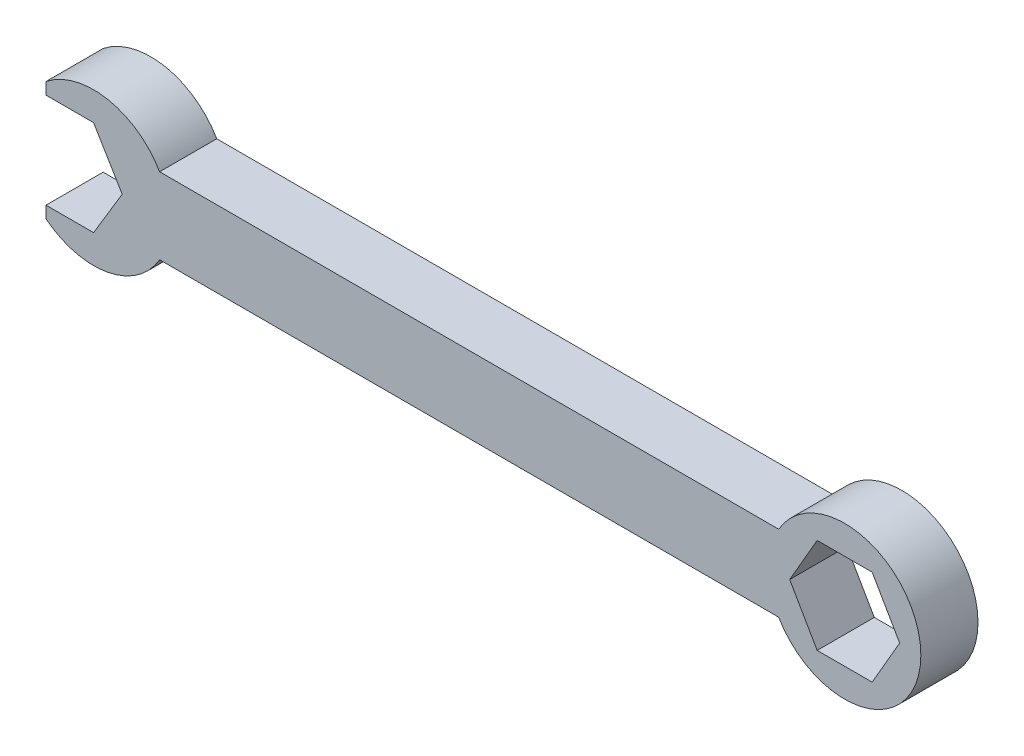
ISO-10303-21;
HEADER;
FILE_DESCRIPTION(('STEP AP214'),'2;1');
FILE_NAME('part.step','',(''),(''),'','','');
FILE_SCHEMA(('AUTOMOTIVE_DESIGN { 1 0 10303 214 1 1 1 1 }'));
ENDSEC;
DATA;
#1=APPLICATION_CONTEXT('core data for automotive mechanical design processes');
#2=APPLICATION_PROTOCOL_DEFINITION('international standard','automotive_design',2000,#1);
#3=PRODUCT_CONTEXT('',#1,'mechanical');
#4=PRODUCT('Part','Part','',(#3));
#5=PRODUCT_RELATED_PRODUCT_CATEGORY('part','',(#4));
#6=PRODUCT_DEFINITION_FORMATION('','',#4);
#7=PRODUCT_DEFINITION_CONTEXT('part definition',#1,'design');
#8=PRODUCT_DEFINITION('design','',#6,#7);
#9=PRODUCT_DEFINITION_SHAPE('','',#8);
#10=(LENGTH_UNIT() NAMED_UNIT(*) SI_UNIT(.MILLI.,.METRE.));
#11=(NAMED_UNIT(*) PLANE_ANGLE_UNIT() SI_UNIT($,.RADIAN.));
#12=(NAMED_UNIT(*) SI_UNIT($,.STERADIAN.) SOLID_ANGLE_UNIT());
#13=UNCERTAINTY_MEASURE_WITH_UNIT(LENGTH_MEASURE(1.E-05),#10,'distance_accuracy_value','');
#14=(GEOMETRIC_REPRESENTATION_CONTEXT(3) GLOBAL_UNCERTAINTY_ASSIGNED_CONTEXT((#13)) GLOBAL_UNIT_ASSIGNED_CONTEXT((#10,
#11,#12)) REPRESENTATION_CONTEXT('',''));
#15=CARTESIAN_POINT('',(0.,0.,0.));
#16=DIRECTION('',(0.,0.,1.));
#17=DIRECTION('',(1.,0.,0.));
#18=AXIS2_PLACEMENT_3D('',#15,#16,#17);
#19=CARTESIAN_POINT('',(77.752488467706,-44.8904201469934,7.62));
#20=DIRECTION('',(-0.866025403784438,0.500000000000001,0.));
#21=DIRECTION('',(-0.500000000000001,-0.866025403784438,0.));
#22=AXIS2_PLACEMENT_3D('',#19,#20,#21);
#23=PLANE('',#22);
#24=DIRECTION('',(0.500000000000001,0.866025403784438,0.));
#25=VECTOR('',#24,1.);
#26=CARTESIAN_POINT('',(77.752488467706,-44.8904201469934,0.));
#27=LINE('',#26,#25);
#28=CARTESIAN_POINT('',(100.003810414254,-6.35,0.));
#29=VERTEX_POINT('',#28);
#30=CARTESIAN_POINT('',(103.669984623608,0.,0.));
#31=VERTEX_POINT('',#30);
#32=EDGE_CURVE('E243',#29,#31,#27,.T.);
#33=ORIENTED_EDGE('',*,*,#32,.F.);
#34=DIRECTION('',(0.,0.,-1.));
#35=VECTOR('',#34,1.);
#36=CARTESIAN_POINT('',(100.003810414254,-6.35,7.62));
#37=LINE('',#36,#35);
#38=CARTESIAN_POINT('',(100.003810414254,-6.35,7.62));
#39=VERTEX_POINT('',#38);
#40=EDGE_CURVE('E11',#39,#29,#37,.T.);
#41=ORIENTED_EDGE('',*,*,#40,.F.);
#42=DIRECTION('',(0.500000000000001,0.866025403784438,0.));
#43=VECTOR('',#42,1.);
#44=CARTESIAN_POINT('',(77.752488467706,-44.8904201469934,7.62));
#45=LINE('',#44,#43);
#46=CARTESIAN_POINT('',(103.669984623608,0.,7.62));
#47=VERTEX_POINT('',#46);
#48=EDGE_CURVE('E360',#39,#47,#45,.T.);
#49=ORIENTED_EDGE('',*,*,#48,.T.);
#50=DIRECTION('',(0.,0.,-1.));
#51=VECTOR('',#50,1.);
#52=CARTESIAN_POINT('',(103.669984623608,0.,7.62));
#53=LINE('',#52,#51);
#54=EDGE_CURVE('E65',#47,#31,#53,.T.);
#55=ORIENTED_EDGE('',*,*,#54,.T.);
#56=EDGE_LOOP('',(#33,#41,#49,#55));
#57=FACE_BOUND('',#56,.T.);
#58=ADVANCED_FACE('F45',(#57),#23,.T.);
#59=CARTESIAN_POINT('',(0.,-6.35000000000003,7.62));
#60=DIRECTION('',(0.,1.,0.));
#61=DIRECTION('',(-1.,0.,0.));
#62=AXIS2_PLACEMENT_3D('',#59,#60,#61);
#63=PLANE('',#62);
#64=DIRECTION('',(1.,0.,0.));
#65=VECTOR('',#64,1.);
#66=CARTESIAN_POINT('',(0.,-6.35000000000003,0.));
#67=LINE('',#66,#65);
#68=CARTESIAN_POINT('',(92.6714619955457,-6.35000000000001,0.));
#69=VERTEX_POINT('',#68);
#70=EDGE_CURVE('E246',#69,#29,#67,.T.);
#71=ORIENTED_EDGE('',*,*,#70,.F.);
#72=DIRECTION('',(0.,0.,-1.));
#73=VECTOR('',#72,1.);
#74=CARTESIAN_POINT('',(92.6714619955457,-6.35000000000001,7.62));
#75=LINE('',#74,#73);
#76=CARTESIAN_POINT('',(92.6714619955457,-6.35000000000001,7.62));
#77=VERTEX_POINT('',#76);
#78=EDGE_CURVE('E56',#77,#69,#75,.T.);
#79=ORIENTED_EDGE('',*,*,#78,.F.);
#80=DIRECTION('',(1.,0.,0.));
#81=VECTOR('',#80,1.);
#82=CARTESIAN_POINT('',(0.,-6.35000000000003,7.62));
#83=LINE('',#82,#81);
#84=EDGE_CURVE('E363',#77,#39,#83,.T.);
#85=ORIENTED_EDGE('',*,*,#84,.T.);
#86=ORIENTED_EDGE('',*,*,#40,.T.);
#87=EDGE_LOOP('',(#71,#79,#85,#86));
#88=FACE_BOUND('',#87,.T.);
#89=ADVANCED_FACE('F386',(#88),#63,.T.);
#90=CARTESIAN_POINT('',(66.7539658396437,38.5404201469933,7.62));
#91=DIRECTION('',(0.866025403784439,0.499999999999999,0.));
#92=DIRECTION('',(-0.499999999999999,0.866025403784439,0.));
#93=AXIS2_PLACEMENT_3D('',#90,#91,#92);
#94=PLANE('',#93);
#95=DIRECTION('',(0.499999999999999,-0.866025403784439,0.));
#96=VECTOR('',#95,1.);
#97=CARTESIAN_POINT('',(66.7539658396437,38.5404201469933,0.));
#98=LINE('',#97,#96);
#99=CARTESIAN_POINT('',(89.0052877861915,0.,0.));
#100=VERTEX_POINT('',#99);
#101=EDGE_CURVE('E250',#100,#69,#98,.T.);
#102=ORIENTED_EDGE('',*,*,#101,.F.);
#103=DIRECTION('',(0.,0.,-1.));
#104=VECTOR('',#103,1.);
#105=CARTESIAN_POINT('',(89.0052877861915,0.,7.62));
#106=LINE('',#105,#104);
#107=CARTESIAN_POINT('',(89.0052877861915,0.,7.62));
#108=VERTEX_POINT('',#107);
#109=EDGE_CURVE('E183',#108,#100,#106,.T.);
#110=ORIENTED_EDGE('',*,*,#109,.F.);
#111=DIRECTION('',(0.499999999999999,-0.866025403784439,0.));
#112=VECTOR('',#111,1.);
#113=CARTESIAN_POINT('',(66.7539658396437,38.5404201469933,7.62));
#114=LINE('',#113,#112);
#115=EDGE_CURVE('E194',#108,#77,#114,.T.);
#116=ORIENTED_EDGE('',*,*,#115,.T.);
#117=ORIENTED_EDGE('',*,*,#78,.T.);
#118=EDGE_LOOP('',(#102,#110,#116,#117));
#119=FACE_BOUND('',#118,.T.);
#120=ADVANCED_FACE('F369',(#119),#94,.T.);
#121=CARTESIAN_POINT('',(66.7539658396437,-38.5404201469933,7.62));
#122=DIRECTION('',(0.866025403784439,-0.5,0.));
#123=DIRECTION('',(0.5,0.866025403784439,0.));
#124=AXIS2_PLACEMENT_3D('',#121,#122,#123);
#125=PLANE('',#124);
#126=DIRECTION('',(-0.5,-0.866025403784439,0.));
#127=VECTOR('',#126,1.);
#128=CARTESIAN_POINT('',(66.7539658396437,-38.5404201469933,0.));
#129=LINE('',#128,#127);
#130=CARTESIAN_POINT('',(92.6714619955457,6.35,0.));
#131=VERTEX_POINT('',#130);
#132=EDGE_CURVE('E178',#131,#100,#129,.T.);
#133=ORIENTED_EDGE('',*,*,#132,.F.);
#134=DIRECTION('',(0.,0.,-1.));
#135=VECTOR('',#134,1.);
#136=CARTESIAN_POINT('',(92.6714619955457,6.35,7.62));
#137=LINE('',#136,#135);
#138=CARTESIAN_POINT('',(92.6714619955457,6.35,7.62));
#139=VERTEX_POINT('',#138);
#140=EDGE_CURVE('E173',#139,#131,#137,.T.);
#141=ORIENTED_EDGE('',*,*,#140,.F.);
#142=DIRECTION('',(-0.5,-0.866025403784439,0.));
#143=VECTOR('',#142,1.);
#144=CARTESIAN_POINT('',(66.7539658396437,-38.5404201469933,7.62));
#145=LINE('',#144,#143);
#146=EDGE_CURVE('E176',#139,#108,#145,.T.);
#147=ORIENTED_EDGE('',*,*,#146,.T.);
#148=ORIENTED_EDGE('',*,*,#109,.T.);
#149=EDGE_LOOP('',(#133,#141,#147,#148));
#150=FACE_BOUND('',#149,.T.);
#151=ADVANCED_FACE('F175',(#150),#125,.T.);
#152=CARTESIAN_POINT('',(0.,6.35,7.62));
#153=DIRECTION('',(0.,-1.,0.));
#154=DIRECTION('',(0.,0.,-1.));
#155=AXIS2_PLACEMENT_3D('',#152,#153,#154);
#156=PLANE('',#155);
#157=DIRECTION('',(-1.,0.,0.));
#158=VECTOR('',#157,1.);
#159=CARTESIAN_POINT('',(0.,6.35,0.));
#160=LINE('',#159,#158);
#161=CARTESIAN_POINT('',(100.003810414254,6.34999999999999,0.));
#162=VERTEX_POINT('',#161);
#163=EDGE_CURVE('E256',#162,#131,#160,.T.);
#164=ORIENTED_EDGE('',*,*,#163,.F.);
#165=DIRECTION('',(0.,0.,-1.));
#166=VECTOR('',#165,1.);
#167=CARTESIAN_POINT('',(100.003810414254,6.34999999999999,7.62));
#168=LINE('',#167,#166);
#169=CARTESIAN_POINT('',(100.003810414254,6.34999999999999,7.62));
#170=VERTEX_POINT('',#169);
#171=EDGE_CURVE('E117',#170,#162,#168,.T.);
#172=ORIENTED_EDGE('',*,*,#171,.F.);
#173=DIRECTION('',(-1.,0.,0.));
#174=VECTOR('',#173,1.);
#175=CARTESIAN_POINT('',(0.,6.35,7.62));
#176=LINE('',#175,#174);
#177=EDGE_CURVE('E191',#170,#139,#176,.T.);
#178=ORIENTED_EDGE('',*,*,#177,.T.);
#179=ORIENTED_EDGE('',*,*,#140,.T.);
#180=EDGE_LOOP('',(#164,#172,#178,#179));
#181=FACE_BOUND('',#180,.T.);
#182=ADVANCED_FACE('F197',(#181),#156,.T.);
#183=CARTESIAN_POINT('',(-3.81,0.,7.62));
#184=DIRECTION('',(0.,0.,-1.));
#185=DIRECTION('',(-1.,0.,0.));
#186=AXIS2_PLACEMENT_3D('',#183,#184,#185);
#187=CYLINDRICAL_SURFACE('',#186,10.16);
#188=CARTESIAN_POINT('',(-3.81,0.,0.));
#189=DIRECTION('',(0.,0.,1.));
#190=DIRECTION('',(1.,0.,0.));
#191=AXIS2_PLACEMENT_3D('',#188,#189,#190);
#192=CIRCLE('',#191,10.16);
#193=CARTESIAN_POINT('',(-10.16,-7.93114745796597,0.));
#194=VERTEX_POINT('',#193);
#195=CARTESIAN_POINT('',(4.98881810244989,-5.08,0.));
#196=VERTEX_POINT('',#195);
#197=EDGE_CURVE('E206',#194,#196,#192,.T.);
#198=ORIENTED_EDGE('',*,*,#197,.T.);
#199=DIRECTION('',(0.,0.,-1.));
#200=VECTOR('',#199,1.);
#201=CARTESIAN_POINT('',(4.98881810244989,-5.08,7.62));
#202=LINE('',#201,#200);
#203=CARTESIAN_POINT('',(4.98881810244989,-5.08,7.62));
#204=VERTEX_POINT('',#203);
#205=EDGE_CURVE('E49',#204,#196,#202,.T.);
#206=ORIENTED_EDGE('',*,*,#205,.F.);
#207=CARTESIAN_POINT('',(-3.81,0.,7.62));
#208=DIRECTION('',(0.,0.,1.));
#209=DIRECTION('',(1.,0.,0.));
#210=AXIS2_PLACEMENT_3D('',#207,#208,#209);
#211=CIRCLE('',#210,10.16);
#212=CARTESIAN_POINT('',(-10.16,-7.93114745796597,7.62));
#213=VERTEX_POINT('',#212);
#214=EDGE_CURVE('E263',#213,#204,#211,.T.);
#215=ORIENTED_EDGE('',*,*,#214,.F.);
#216=DIRECTION('',(0.,0.,-1.));
#217=VECTOR('',#216,1.);
#218=CARTESIAN_POINT('',(-10.16,-7.93114745796597,7.62));
#219=LINE('',#218,#217);
#220=EDGE_CURVE('E202',#213,#194,#219,.T.);
#221=ORIENTED_EDGE('',*,*,#220,.T.);
#222=EDGE_LOOP('',(#198,#206,#215,#221));
#223=FACE_BOUND('',#222,.T.);
#224=ADVANCED_FACE('F311',(#223),#187,.T.);
#225=CARTESIAN_POINT('',(0.,-5.08,7.62));
#226=DIRECTION('',(0.,1.,0.));
#227=DIRECTION('',(0.,0.,1.));
#228=AXIS2_PLACEMENT_3D('',#225,#226,#227);
#229=PLANE('',#228);
#230=DIRECTION('',(1.,0.,0.));
#231=VECTOR('',#230,1.);
#232=CARTESIAN_POINT('',(0.,-5.08,0.));
#233=LINE('',#232,#231);
#234=CARTESIAN_POINT('',(87.5388181024499,-5.08,0.));
#235=VERTEX_POINT('',#234);
#236=EDGE_CURVE('E210',#196,#235,#233,.T.);
#237=ORIENTED_EDGE('',*,*,#236,.T.);
#238=DIRECTION('',(0.,0.,-1.));
#239=VECTOR('',#238,1.);
#240=CARTESIAN_POINT('',(87.5388181024499,-5.08,7.62));
#241=LINE('',#240,#239);
#242=CARTESIAN_POINT('',(87.5388181024499,-5.08,7.62));
#243=VERTEX_POINT('',#242);
#244=EDGE_CURVE('E300',#243,#235,#241,.T.);
#245=ORIENTED_EDGE('',*,*,#244,.F.);
#246=DIRECTION('',(1.,0.,0.));
#247=VECTOR('',#246,1.);
#248=CARTESIAN_POINT('',(0.,-5.08,7.62));
#249=LINE('',#248,#247);
#250=EDGE_CURVE('E130',#204,#243,#249,.T.);
#251=ORIENTED_EDGE('',*,*,#250,.F.);
#252=ORIENTED_EDGE('',*,*,#205,.T.);
#253=EDGE_LOOP('',(#237,#245,#251,#252));
#254=FACE_BOUND('',#253,.T.);
#255=ADVANCED_FACE('F47',(#254),#229,.F.);
#256=CARTESIAN_POINT('',(96.3376362048998,0.,7.62));
#257=DIRECTION('',(0.,0.,-1.));
#258=DIRECTION('',(-1.,0.,0.));
#259=AXIS2_PLACEMENT_3D('',#256,#257,#258);
#260=CYLINDRICAL_SURFACE('',#259,10.16);
#261=CARTESIAN_POINT('',(96.3376362048998,0.,0.));
#262=DIRECTION('',(0.,0.,1.));
#263=DIRECTION('',(1.,0.,0.));
#264=AXIS2_PLACEMENT_3D('',#261,#262,#263);
#265=CIRCLE('',#264,10.16);
#266=CARTESIAN_POINT('',(87.5388181024499,5.08,0.));
#267=VERTEX_POINT('',#266);
#268=EDGE_CURVE('E214',#235,#267,#265,.T.);
#269=ORIENTED_EDGE('',*,*,#268,.T.);
#270=DIRECTION('',(0.,0.,-1.));
#271=VECTOR('',#270,1.);
#272=CARTESIAN_POINT('',(87.5388181024499,5.08,7.62));
#273=LINE('',#272,#271);
#274=CARTESIAN_POINT('',(87.5388181024499,5.08,7.62));
#275=VERTEX_POINT('',#274);
#276=EDGE_CURVE('E298',#275,#267,#273,.T.);
#277=ORIENTED_EDGE('',*,*,#276,.F.);
#278=CARTESIAN_POINT('',(96.3376362048998,0.,7.62));
#279=DIRECTION('',(0.,0.,1.));
#280=DIRECTION('',(1.,0.,0.));
#281=AXIS2_PLACEMENT_3D('',#278,#279,#280);
#282=CIRCLE('',#281,10.16);
#283=EDGE_CURVE('E323',#243,#275,#282,.T.);
#284=ORIENTED_EDGE('',*,*,#283,.F.);
#285=ORIENTED_EDGE('',*,*,#244,.T.);
#286=EDGE_LOOP('',(#269,#277,#284,#285));
#287=FACE_BOUND('',#286,.T.);
#288=ADVANCED_FACE('F321',(#287),#260,.T.);
#289=CARTESIAN_POINT('',(0.,5.08,7.62));
#290=DIRECTION('',(0.,1.,0.));
#291=DIRECTION('',(0.,0.,1.));
#292=AXIS2_PLACEMENT_3D('',#289,#290,#291);
#293=PLANE('',#292);
#294=DIRECTION('',(1.,0.,0.));
#295=VECTOR('',#294,1.);
#296=CARTESIAN_POINT('',(0.,5.08,0.));
#297=LINE('',#296,#295);
#298=CARTESIAN_POINT('',(4.98881810244989,5.08,0.));
#299=VERTEX_POINT('',#298);
#300=EDGE_CURVE('E218',#299,#267,#297,.T.);
#301=ORIENTED_EDGE('',*,*,#300,.F.);
#302=DIRECTION('',(0.,0.,-1.));
#303=VECTOR('',#302,1.);
#304=CARTESIAN_POINT('',(4.98881810244989,5.08,7.62));
#305=LINE('',#304,#303);
#306=CARTESIAN_POINT('',(4.98881810244989,5.08,7.62));
#307=VERTEX_POINT('',#306);
#308=EDGE_CURVE('E295',#307,#299,#305,.T.);
#309=ORIENTED_EDGE('',*,*,#308,.F.);
#310=DIRECTION('',(1.,0.,0.));
#311=VECTOR('',#310,1.);
#312=CARTESIAN_POINT('',(0.,5.08,7.62));
#313=LINE('',#312,#311);
#314=EDGE_CURVE('E326',#307,#275,#313,.T.);
#315=ORIENTED_EDGE('',*,*,#314,.T.);
#316=ORIENTED_EDGE('',*,*,#276,.T.);
#317=EDGE_LOOP('',(#301,#309,#315,#316));
#318=FACE_BOUND('',#317,.T.);
#319=ADVANCED_FACE('F327',(#318),#293,.T.);
#320=CARTESIAN_POINT('',(-10.16,7.93114745796596,0.));
#321=VERTEX_POINT('',#320);
#322=EDGE_CURVE('E211',#299,#321,#192,.T.);
#323=ORIENTED_EDGE('',*,*,#322,.T.);
#324=DIRECTION('',(0.,0.,-1.));
#325=VECTOR('',#324,1.);
#326=CARTESIAN_POINT('',(-10.16,7.93114745796596,7.62));
#327=LINE('',#326,#325);
#328=CARTESIAN_POINT('',(-10.16,7.93114745796596,7.62));
#329=VERTEX_POINT('',#328);
#330=EDGE_CURVE('E292',#329,#321,#327,.T.);
#331=ORIENTED_EDGE('',*,*,#330,.F.);
#332=EDGE_CURVE('E331',#307,#329,#211,.T.);
#333=ORIENTED_EDGE('',*,*,#332,.F.);
#334=ORIENTED_EDGE('',*,*,#308,.T.);
#335=EDGE_LOOP('',(#323,#331,#333,#334));
#336=FACE_BOUND('',#335,.T.);
#337=ADVANCED_FACE('F413',(#336),#187,.T.);
#338=CARTESIAN_POINT('',(-10.16,0.,7.62));
#339=DIRECTION('',(-1.,0.,0.));
#340=DIRECTION('',(0.,0.,1.));
#341=AXIS2_PLACEMENT_3D('',#338,#339,#340);
#342=PLANE('',#341);
#343=DIRECTION('',(0.,1.,0.));
#344=VECTOR('',#343,1.);
#345=CARTESIAN_POINT('',(-10.16,0.,0.));
#346=LINE('',#345,#344);
#347=CARTESIAN_POINT('',(-10.16,6.35,0.));
#348=VERTEX_POINT('',#347);
#349=EDGE_CURVE('E222',#348,#321,#346,.T.);
#350=ORIENTED_EDGE('',*,*,#349,.F.);
#351=DIRECTION('',(0.,0.,-1.));
#352=VECTOR('',#351,1.);
#353=CARTESIAN_POINT('',(-10.16,6.35,7.62));
#354=LINE('',#353,#352);
#355=CARTESIAN_POINT('',(-10.16,6.35,7.62));
#356=VERTEX_POINT('',#355);
#357=EDGE_CURVE('E289',#356,#348,#354,.T.);
#358=ORIENTED_EDGE('',*,*,#357,.F.);
#359=DIRECTION('',(0.,1.,0.));
#360=VECTOR('',#359,1.);
#361=CARTESIAN_POINT('',(-10.16,0.,7.62));
#362=LINE('',#361,#360);
#363=EDGE_CURVE('E335',#356,#329,#362,.T.);
#364=ORIENTED_EDGE('',*,*,#363,.T.);
#365=ORIENTED_EDGE('',*,*,#330,.T.);
#366=EDGE_LOOP('',(#350,#358,#364,#365));
#367=FACE_BOUND('',#366,.T.);
#368=ADVANCED_FACE('F409',(#367),#342,.T.);
#369=CARTESIAN_POINT('',(0.,6.35,7.62));
#370=DIRECTION('',(0.,-1.,0.));
#371=DIRECTION('',(1.,0.,0.));
#372=AXIS2_PLACEMENT_3D('',#369,#370,#371);
#373=PLANE('',#372);
#374=DIRECTION('',(-1.,0.,0.));
#375=VECTOR('',#374,1.);
#376=CARTESIAN_POINT('',(0.,6.35,0.));
#377=LINE('',#376,#375);
#378=CARTESIAN_POINT('',(-3.81,6.35,0.));
#379=VERTEX_POINT('',#378);
#380=EDGE_CURVE('E226',#379,#348,#377,.T.);
#381=ORIENTED_EDGE('',*,*,#380,.F.);
#382=DIRECTION('',(0.,0.,-1.));
#383=VECTOR('',#382,1.);
#384=CARTESIAN_POINT('',(-3.81,6.35,7.62));
#385=LINE('',#384,#383);
#386=CARTESIAN_POINT('',(-3.81,6.35,7.62));
#387=VERTEX_POINT('',#386);
#388=EDGE_CURVE('E286',#387,#379,#385,.T.);
#389=ORIENTED_EDGE('',*,*,#388,.F.);
#390=DIRECTION('',(-1.,0.,0.));
#391=VECTOR('',#390,1.);
#392=CARTESIAN_POINT('',(0.,6.35,7.62));
#393=LINE('',#392,#391);
#394=EDGE_CURVE('E343',#387,#356,#393,.T.);
#395=ORIENTED_EDGE('',*,*,#394,.T.);
#396=ORIENTED_EDGE('',*,*,#357,.T.);
#397=EDGE_LOOP('',(#381,#389,#395,#396));
#398=FACE_BOUND('',#397,.T.);
#399=ADVANCED_FACE('F405',(#398),#373,.T.);
#400=CARTESIAN_POINT('',(0.,0.,7.62));
#401=DIRECTION('',(-0.857492925712544,-0.514495755427527,0.));
#402=DIRECTION('',(0.514495755427527,-0.857492925712544,0.));
#403=AXIS2_PLACEMENT_3D('',#400,#401,#402);
#404=PLANE('',#403);
#405=DIRECTION('',(-0.514495755427527,0.857492925712544,0.));
#406=VECTOR('',#405,1.);
#407=CARTESIAN_POINT('',(0.,0.,0.));
#408=LINE('',#407,#406);
#409=CARTESIAN_POINT('',(0.,0.,0.));
#410=VERTEX_POINT('',#409);
#411=EDGE_CURVE('E230',#410,#379,#408,.T.);
#412=ORIENTED_EDGE('',*,*,#411,.F.);
#413=DIRECTION('',(0.,0.,-1.));
#414=VECTOR('',#413,1.);
#415=CARTESIAN_POINT('',(0.,0.,7.62));
#416=LINE('',#415,#414);
#417=CARTESIAN_POINT('',(0.,0.,7.62));
#418=VERTEX_POINT('',#417);
#419=EDGE_CURVE('E283',#418,#410,#416,.T.);
#420=ORIENTED_EDGE('',*,*,#419,.F.);
#421=DIRECTION('',(-0.514495755427527,0.857492925712544,0.));
#422=VECTOR('',#421,1.);
#423=CARTESIAN_POINT('',(0.,0.,7.62));
#424=LINE('',#423,#422);
#425=EDGE_CURVE('E347',#418,#387,#424,.T.);
#426=ORIENTED_EDGE('',*,*,#425,.T.);
#427=ORIENTED_EDGE('',*,*,#388,.T.);
#428=EDGE_LOOP('',(#412,#420,#426,#427));
#429=FACE_BOUND('',#428,.T.);
#430=ADVANCED_FACE('F401',(#429),#404,.T.);
#431=CARTESIAN_POINT('',(0.,0.,7.62));
#432=DIRECTION('',(0.857492925712544,-0.514495755427527,0.));
#433=DIRECTION('',(0.514495755427527,0.857492925712544,0.));
#434=AXIS2_PLACEMENT_3D('',#431,#432,#433);
#435=PLANE('',#434);
#436=DIRECTION('',(-0.514495755427527,-0.857492925712544,0.));
#437=VECTOR('',#436,1.);
#438=CARTESIAN_POINT('',(0.,0.,0.));
#439=LINE('',#438,#437);
#440=CARTESIAN_POINT('',(-3.81,-6.35,0.));
#441=VERTEX_POINT('',#440);
#442=EDGE_CURVE('E234',#410,#441,#439,.T.);
#443=ORIENTED_EDGE('',*,*,#442,.T.);
#444=DIRECTION('',(0.,0.,-1.));
#445=VECTOR('',#444,1.);
#446=CARTESIAN_POINT('',(-3.81,-6.35,7.62));
#447=LINE('',#446,#445);
#448=CARTESIAN_POINT('',(-3.81,-6.35,7.62));
#449=VERTEX_POINT('',#448);
#450=EDGE_CURVE('E279',#449,#441,#447,.T.);
#451=ORIENTED_EDGE('',*,*,#450,.F.);
#452=DIRECTION('',(-0.514495755427527,-0.857492925712544,0.));
#453=VECTOR('',#452,1.);
#454=CARTESIAN_POINT('',(0.,0.,7.62));
#455=LINE('',#454,#453);
#456=EDGE_CURVE('E351',#418,#449,#455,.T.);
#457=ORIENTED_EDGE('',*,*,#456,.F.);
#458=ORIENTED_EDGE('',*,*,#419,.T.);
#459=EDGE_LOOP('',(#443,#451,#457,#458));
#460=FACE_BOUND('',#459,.T.);
#461=ADVANCED_FACE('F397',(#460),#435,.F.);
#462=CARTESIAN_POINT('',(0.,-6.35,7.62));
#463=DIRECTION('',(0.,-1.,0.));
#464=DIRECTION('',(1.,0.,0.));
#465=AXIS2_PLACEMENT_3D('',#462,#463,#464);
#466=PLANE('',#465);
#467=DIRECTION('',(-1.,0.,0.));
#468=VECTOR('',#467,1.);
#469=CARTESIAN_POINT('',(0.,-6.35,0.));
#470=LINE('',#469,#468);
#471=CARTESIAN_POINT('',(-10.16,-6.35,0.));
#472=VERTEX_POINT('',#471);
#473=EDGE_CURVE('E237',#441,#472,#470,.T.);
#474=ORIENTED_EDGE('',*,*,#473,.T.);
#475=DIRECTION('',(0.,0.,-1.));
#476=VECTOR('',#475,1.);
#477=CARTESIAN_POINT('',(-10.16,-6.35,7.62));
#478=LINE('',#477,#476);
#479=CARTESIAN_POINT('',(-10.16,-6.35,7.62));
#480=VERTEX_POINT('',#479);
#481=EDGE_CURVE('E275',#480,#472,#478,.T.);
#482=ORIENTED_EDGE('',*,*,#481,.F.);
#483=DIRECTION('',(-1.,0.,0.));
#484=VECTOR('',#483,1.);
#485=CARTESIAN_POINT('',(0.,-6.35,7.62));
#486=LINE('',#485,#484);
#487=EDGE_CURVE('E354',#449,#480,#486,.T.);
#488=ORIENTED_EDGE('',*,*,#487,.F.);
#489=ORIENTED_EDGE('',*,*,#450,.T.);
#490=EDGE_LOOP('',(#474,#482,#488,#489));
#491=FACE_BOUND('',#490,.T.);
#492=ADVANCED_FACE('F380',(#491),#466,.F.);
#493=CARTESIAN_POINT('',(-10.16,0.,7.62));
#494=DIRECTION('',(1.,0.,0.));
#495=DIRECTION('',(0.,1.,0.));
#496=AXIS2_PLACEMENT_3D('',#493,#494,#495);
#497=PLANE('',#496);
#498=DIRECTION('',(0.,-1.,0.));
#499=VECTOR('',#498,1.);
#500=CARTESIAN_POINT('',(-10.16,0.,0.));
#501=LINE('',#500,#499);
#502=EDGE_CURVE('E240',#472,#194,#501,.T.);
#503=ORIENTED_EDGE('',*,*,#502,.T.);
#504=ORIENTED_EDGE('',*,*,#220,.F.);
#505=DIRECTION('',(0.,-1.,0.));
#506=VECTOR('',#505,1.);
#507=CARTESIAN_POINT('',(-10.16,0.,7.62));
#508=LINE('',#507,#506);
#509=EDGE_CURVE('E357',#480,#213,#508,.T.);
#510=ORIENTED_EDGE('',*,*,#509,.F.);
#511=ORIENTED_EDGE('',*,*,#481,.T.);
#512=EDGE_LOOP('',(#503,#504,#510,#511));
#513=FACE_BOUND('',#512,.T.);
#514=ADVANCED_FACE('F373',(#513),#497,.F.);
#515=CARTESIAN_POINT('',(77.752488467706,44.8904201469933,7.62));
#516=DIRECTION('',(-0.866025403784439,-0.5,0.));
#517=DIRECTION('',(0.5,-0.866025403784439,0.));
#518=AXIS2_PLACEMENT_3D('',#515,#516,#517);
#519=PLANE('',#518);
#520=DIRECTION('',(-0.5,0.866025403784439,0.));
#521=VECTOR('',#520,1.);
#522=CARTESIAN_POINT('',(77.752488467706,44.8904201469933,0.));
#523=LINE('',#522,#521);
#524=EDGE_CURVE('E259',#31,#162,#523,.T.);
#525=ORIENTED_EDGE('',*,*,#524,.F.);
#526=ORIENTED_EDGE('',*,*,#54,.F.);
#527=DIRECTION('',(-0.5,0.866025403784439,0.));
#528=VECTOR('',#527,1.);
#529=CARTESIAN_POINT('',(77.752488467706,44.8904201469933,7.62));
#530=LINE('',#529,#528);
#531=EDGE_CURVE('E199',#47,#170,#530,.T.);
#532=ORIENTED_EDGE('',*,*,#531,.T.);
#533=ORIENTED_EDGE('',*,*,#171,.T.);
#534=EDGE_LOOP('',(#525,#526,#532,#533));
#535=FACE_BOUND('',#534,.T.);
#536=ADVANCED_FACE('F371',(#535),#519,.T.);
#537=CARTESIAN_POINT('',(0.,0.,7.62));
#538=DIRECTION('',(0.,0.,1.));
#539=DIRECTION('',(1.,0.,0.));
#540=AXIS2_PLACEMENT_3D('',#537,#538,#539);
#541=PLANE('',#540);
#542=ORIENTED_EDGE('',*,*,#214,.T.);
#543=ORIENTED_EDGE('',*,*,#250,.T.);
#544=ORIENTED_EDGE('',*,*,#283,.T.);
#545=ORIENTED_EDGE('',*,*,#314,.F.);
#546=ORIENTED_EDGE('',*,*,#332,.T.);
#547=ORIENTED_EDGE('',*,*,#363,.F.);
#548=ORIENTED_EDGE('',*,*,#394,.F.);
#549=ORIENTED_EDGE('',*,*,#425,.F.);
#550=ORIENTED_EDGE('',*,*,#456,.T.);
#551=ORIENTED_EDGE('',*,*,#487,.T.);
#552=ORIENTED_EDGE('',*,*,#509,.T.);
#553=EDGE_LOOP('',(#542,#543,#544,#545,#546,#547,#548,#549,#550,#551,#552));
#554=FACE_BOUND('',#553,.T.);
#555=ORIENTED_EDGE('',*,*,#48,.F.);
#556=ORIENTED_EDGE('',*,*,#84,.F.);
#557=ORIENTED_EDGE('',*,*,#115,.F.);
#558=ORIENTED_EDGE('',*,*,#146,.F.);
#559=ORIENTED_EDGE('',*,*,#177,.F.);
#560=ORIENTED_EDGE('',*,*,#531,.F.);
#561=EDGE_LOOP('',(#555,#556,#557,#558,#559,#560));
#562=FACE_BOUND('',#561,.T.);
#563=ADVANCED_FACE('F189',(#554,#562),#541,.T.);
#564=CARTESIAN_POINT('',(0.,0.,0.));
#565=DIRECTION('',(0.,0.,1.));
#566=DIRECTION('',(1.,0.,0.));
#567=AXIS2_PLACEMENT_3D('',#564,#565,#566);
#568=PLANE('',#567);
#569=ORIENTED_EDGE('',*,*,#197,.F.);
#570=ORIENTED_EDGE('',*,*,#502,.F.);
#571=ORIENTED_EDGE('',*,*,#473,.F.);
#572=ORIENTED_EDGE('',*,*,#442,.F.);
#573=ORIENTED_EDGE('',*,*,#411,.T.);
#574=ORIENTED_EDGE('',*,*,#380,.T.);
#575=ORIENTED_EDGE('',*,*,#349,.T.);
#576=ORIENTED_EDGE('',*,*,#322,.F.);
#577=ORIENTED_EDGE('',*,*,#300,.T.);
#578=ORIENTED_EDGE('',*,*,#268,.F.);
#579=ORIENTED_EDGE('',*,*,#236,.F.);
#580=EDGE_LOOP('',(#569,#570,#571,#572,#573,#574,#575,#576,#577,#578,#579));
#581=FACE_BOUND('',#580,.T.);
#582=ORIENTED_EDGE('',*,*,#32,.T.);
#583=ORIENTED_EDGE('',*,*,#524,.T.);
#584=ORIENTED_EDGE('',*,*,#163,.T.);
#585=ORIENTED_EDGE('',*,*,#132,.T.);
#586=ORIENTED_EDGE('',*,*,#101,.T.);
#587=ORIENTED_EDGE('',*,*,#70,.T.);
#588=EDGE_LOOP('',(#582,#583,#584,#585,#586,#587));
#589=FACE_BOUND('',#588,.T.);
#590=ADVANCED_FACE('F315',(#581,#589),#568,.F.);
#591=CLOSED_SHELL('',(#58,#89,#120,#151,#182,#224,#255,#288,#319,#337,#368,#399,#430,#461,#492,
#514,#536,#563,#590));
#592=MANIFOLD_SOLID_BREP('B2',#591);
#593=ADVANCED_BREP_SHAPE_REPRESENTATION('',(#18,#592),#14);
#594=SHAPE_DEFINITION_REPRESENTATION(#9,#593);
ENDSEC;
END-ISO-10303-21;
